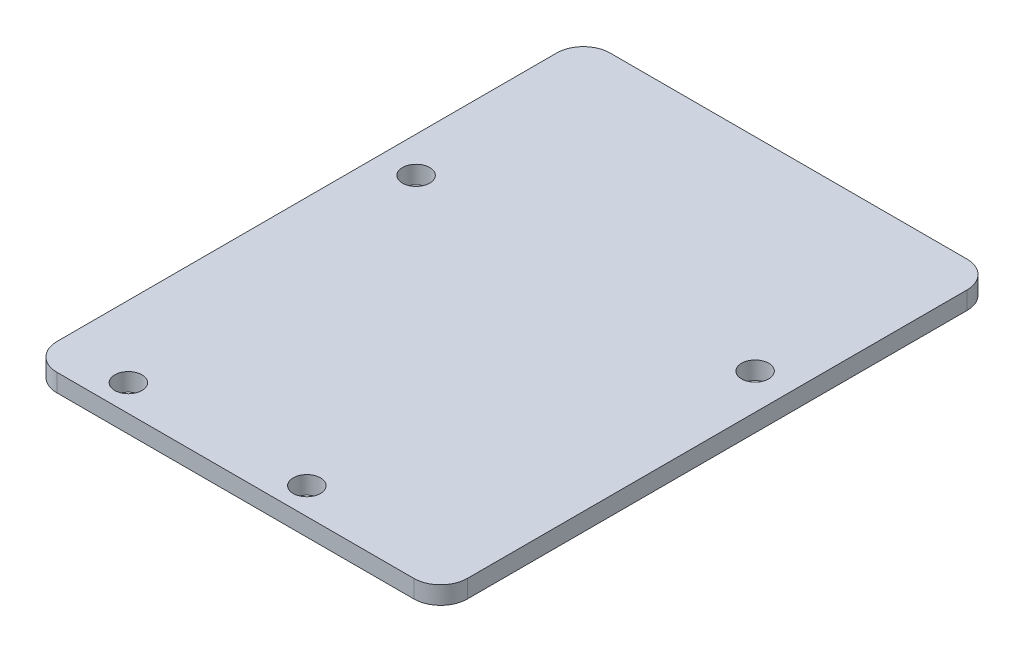
ISO-10303-21;
HEADER;
FILE_DESCRIPTION(('STEP AP214'),'2;1');
FILE_NAME('part.step','',(''),(''),'','','');
FILE_SCHEMA(('AUTOMOTIVE_DESIGN { 1 0 10303 214 1 1 1 1 }'));
ENDSEC;
DATA;
#1=APPLICATION_CONTEXT('core data for automotive mechanical design processes');
#2=APPLICATION_PROTOCOL_DEFINITION('international standard','automotive_design',2000,#1);
#3=PRODUCT_CONTEXT('',#1,'mechanical');
#4=PRODUCT('Part','Part','',(#3));
#5=PRODUCT_RELATED_PRODUCT_CATEGORY('part','',(#4));
#6=PRODUCT_DEFINITION_FORMATION('','',#4);
#7=PRODUCT_DEFINITION_CONTEXT('part definition',#1,'design');
#8=PRODUCT_DEFINITION('design','',#6,#7);
#9=PRODUCT_DEFINITION_SHAPE('','',#8);
#10=(LENGTH_UNIT() NAMED_UNIT(*) SI_UNIT(.MILLI.,.METRE.));
#11=(NAMED_UNIT(*) PLANE_ANGLE_UNIT() SI_UNIT($,.RADIAN.));
#12=(NAMED_UNIT(*) SI_UNIT($,.STERADIAN.) SOLID_ANGLE_UNIT());
#13=UNCERTAINTY_MEASURE_WITH_UNIT(LENGTH_MEASURE(1.E-05),#10,'distance_accuracy_value','');
#14=(GEOMETRIC_REPRESENTATION_CONTEXT(3) GLOBAL_UNCERTAINTY_ASSIGNED_CONTEXT((#13)) GLOBAL_UNIT_ASSIGNED_CONTEXT((#10,
#11,#12)) REPRESENTATION_CONTEXT('',''));
#15=CARTESIAN_POINT('',(0.,0.,0.));
#16=DIRECTION('',(0.,0.,1.));
#17=DIRECTION('',(1.,0.,0.));
#18=AXIS2_PLACEMENT_3D('',#15,#16,#17);
#19=CARTESIAN_POINT('',(23.,2.,31.));
#20=DIRECTION('',(-1.,0.,0.));
#21=DIRECTION('',(0.,0.,1.));
#22=AXIS2_PLACEMENT_3D('',#19,#20,#21);
#23=PLANE('',#22);
#24=DIRECTION('',(0.,0.,-1.));
#25=VECTOR('',#24,1.);
#26=CARTESIAN_POINT('',(23.,0.,31.));
#27=LINE('',#26,#25);
#28=CARTESIAN_POINT('',(23.,0.,28.));
#29=VERTEX_POINT('',#28);
#30=CARTESIAN_POINT('',(23.,0.,-28.));
#31=VERTEX_POINT('',#30);
#32=EDGE_CURVE('E129',#29,#31,#27,.T.);
#33=ORIENTED_EDGE('',*,*,#32,.T.);
#34=DIRECTION('',(0.,-1.,0.));
#35=VECTOR('',#34,1.);
#36=CARTESIAN_POINT('',(23.,2.,-28.));
#37=LINE('',#36,#35);
#38=CARTESIAN_POINT('',(23.,2.,-28.));
#39=VERTEX_POINT('',#38);
#40=EDGE_CURVE('E152',#31,#39,#37,.F.);
#41=ORIENTED_EDGE('',*,*,#40,.T.);
#42=DIRECTION('',(0.,0.,-1.));
#43=VECTOR('',#42,1.);
#44=CARTESIAN_POINT('',(23.,2.,31.));
#45=LINE('',#44,#43);
#46=CARTESIAN_POINT('',(23.,2.,28.));
#47=VERTEX_POINT('',#46);
#48=EDGE_CURVE('E127',#47,#39,#45,.T.);
#49=ORIENTED_EDGE('',*,*,#48,.F.);
#50=DIRECTION('',(0.,-1.,0.));
#51=VECTOR('',#50,1.);
#52=CARTESIAN_POINT('',(23.,2.,28.));
#53=LINE('',#52,#51);
#54=EDGE_CURVE('E149',#47,#29,#53,.T.);
#55=ORIENTED_EDGE('',*,*,#54,.T.);
#56=EDGE_LOOP('',(#33,#41,#49,#55));
#57=FACE_BOUND('',#56,.T.);
#58=ADVANCED_FACE('F34',(#57),#23,.F.);
#59=CARTESIAN_POINT('',(-23.,2.,-31.));
#60=DIRECTION('',(0.,0.,1.));
#61=DIRECTION('',(1.,0.,0.));
#62=AXIS2_PLACEMENT_3D('',#59,#60,#61);
#63=PLANE('',#62);
#64=DIRECTION('',(-1.,0.,0.));
#65=VECTOR('',#64,1.);
#66=CARTESIAN_POINT('',(-23.,0.,-31.));
#67=LINE('',#66,#65);
#68=CARTESIAN_POINT('',(20.,0.,-31.));
#69=VERTEX_POINT('',#68);
#70=CARTESIAN_POINT('',(-20.,0.,-31.));
#71=VERTEX_POINT('',#70);
#72=EDGE_CURVE('E125',#69,#71,#67,.T.);
#73=ORIENTED_EDGE('',*,*,#72,.T.);
#74=DIRECTION('',(0.,-1.,0.));
#75=VECTOR('',#74,1.);
#76=CARTESIAN_POINT('',(-20.,2.,-31.));
#77=LINE('',#76,#75);
#78=CARTESIAN_POINT('',(-20.,2.,-31.));
#79=VERTEX_POINT('',#78);
#80=EDGE_CURVE('E104',#71,#79,#77,.F.);
#81=ORIENTED_EDGE('',*,*,#80,.T.);
#82=DIRECTION('',(-1.,0.,0.));
#83=VECTOR('',#82,1.);
#84=CARTESIAN_POINT('',(-23.,2.,-31.));
#85=LINE('',#84,#83);
#86=CARTESIAN_POINT('',(20.,2.,-31.));
#87=VERTEX_POINT('',#86);
#88=EDGE_CURVE('E168',#87,#79,#85,.T.);
#89=ORIENTED_EDGE('',*,*,#88,.F.);
#90=DIRECTION('',(0.,-1.,0.));
#91=VECTOR('',#90,1.);
#92=CARTESIAN_POINT('',(20.,2.,-31.));
#93=LINE('',#92,#91);
#94=EDGE_CURVE('E109',#87,#69,#93,.T.);
#95=ORIENTED_EDGE('',*,*,#94,.T.);
#96=EDGE_LOOP('',(#73,#81,#89,#95));
#97=FACE_BOUND('',#96,.T.);
#98=ADVANCED_FACE('F219',(#97),#63,.F.);
#99=CARTESIAN_POINT('',(-23.,2.,31.));
#100=DIRECTION('',(1.,0.,0.));
#101=DIRECTION('',(0.,0.,-1.));
#102=AXIS2_PLACEMENT_3D('',#99,#100,#101);
#103=PLANE('',#102);
#104=DIRECTION('',(0.,0.,1.));
#105=VECTOR('',#104,1.);
#106=CARTESIAN_POINT('',(-23.,2.,31.));
#107=LINE('',#106,#105);
#108=CARTESIAN_POINT('',(-23.,2.,-28.));
#109=VERTEX_POINT('',#108);
#110=CARTESIAN_POINT('',(-23.,2.,28.));
#111=VERTEX_POINT('',#110);
#112=EDGE_CURVE('E118',#109,#111,#107,.T.);
#113=ORIENTED_EDGE('',*,*,#112,.F.);
#114=DIRECTION('',(0.,-1.,0.));
#115=VECTOR('',#114,1.);
#116=CARTESIAN_POINT('',(-23.,2.,-28.));
#117=LINE('',#116,#115);
#118=CARTESIAN_POINT('',(-23.,0.,-28.));
#119=VERTEX_POINT('',#118);
#120=EDGE_CURVE('E103',#109,#119,#117,.T.);
#121=ORIENTED_EDGE('',*,*,#120,.T.);
#122=DIRECTION('',(0.,0.,1.));
#123=VECTOR('',#122,1.);
#124=CARTESIAN_POINT('',(-23.,0.,31.));
#125=LINE('',#124,#123);
#126=CARTESIAN_POINT('',(-23.,0.,28.));
#127=VERTEX_POINT('',#126);
#128=EDGE_CURVE('E116',#119,#127,#125,.T.);
#129=ORIENTED_EDGE('',*,*,#128,.T.);
#130=DIRECTION('',(0.,-1.,0.));
#131=VECTOR('',#130,1.);
#132=CARTESIAN_POINT('',(-23.,2.,28.));
#133=LINE('',#132,#131);
#134=EDGE_CURVE('E120',#127,#111,#133,.F.);
#135=ORIENTED_EDGE('',*,*,#134,.T.);
#136=EDGE_LOOP('',(#113,#121,#129,#135));
#137=FACE_BOUND('',#136,.T.);
#138=ADVANCED_FACE('F115',(#137),#103,.F.);
#139=CARTESIAN_POINT('',(-23.,2.,31.));
#140=DIRECTION('',(0.,0.,-1.));
#141=DIRECTION('',(-1.,0.,0.));
#142=AXIS2_PLACEMENT_3D('',#139,#140,#141);
#143=PLANE('',#142);
#144=DIRECTION('',(1.,0.,0.));
#145=VECTOR('',#144,1.);
#146=CARTESIAN_POINT('',(-23.,0.,31.));
#147=LINE('',#146,#145);
#148=CARTESIAN_POINT('',(-20.,0.,31.));
#149=VERTEX_POINT('',#148);
#150=CARTESIAN_POINT('',(20.,0.,31.));
#151=VERTEX_POINT('',#150);
#152=EDGE_CURVE('E124',#149,#151,#147,.T.);
#153=ORIENTED_EDGE('',*,*,#152,.T.);
#154=DIRECTION('',(0.,-1.,0.));
#155=VECTOR('',#154,1.);
#156=CARTESIAN_POINT('',(20.,2.,31.));
#157=LINE('',#156,#155);
#158=CARTESIAN_POINT('',(20.,2.,31.));
#159=VERTEX_POINT('',#158);
#160=EDGE_CURVE('E11',#151,#159,#157,.F.);
#161=ORIENTED_EDGE('',*,*,#160,.T.);
#162=DIRECTION('',(1.,0.,0.));
#163=VECTOR('',#162,1.);
#164=CARTESIAN_POINT('',(-23.,2.,31.));
#165=LINE('',#164,#163);
#166=CARTESIAN_POINT('',(-20.,2.,31.));
#167=VERTEX_POINT('',#166);
#168=EDGE_CURVE('E133',#167,#159,#165,.T.);
#169=ORIENTED_EDGE('',*,*,#168,.F.);
#170=DIRECTION('',(0.,-1.,0.));
#171=VECTOR('',#170,1.);
#172=CARTESIAN_POINT('',(-20.,2.,31.));
#173=LINE('',#172,#171);
#174=EDGE_CURVE('E42',#167,#149,#173,.T.);
#175=ORIENTED_EDGE('',*,*,#174,.T.);
#176=EDGE_LOOP('',(#153,#161,#169,#175));
#177=FACE_BOUND('',#176,.T.);
#178=ADVANCED_FACE('F155',(#177),#143,.F.);
#179=CARTESIAN_POINT('',(0.,2.,0.));
#180=DIRECTION('',(0.,-1.,0.));
#181=DIRECTION('',(0.,0.,-1.));
#182=AXIS2_PLACEMENT_3D('',#179,#180,#181);
#183=PLANE('',#182);
#184=CARTESIAN_POINT('',(5.,2.,28.));
#185=DIRECTION('',(0.,-1.,0.));
#186=DIRECTION('',(0.,0.,-1.));
#187=AXIS2_PLACEMENT_3D('',#184,#185,#186);
#188=CIRCLE('',#187,1.525);
#189=CARTESIAN_POINT('',(5.,2.,26.475));
#190=VERTEX_POINT('',#189);
#191=EDGE_CURVE('E188',#190,#190,#188,.F.);
#192=ORIENTED_EDGE('',*,*,#191,.F.);
#193=EDGE_LOOP('',(#192));
#194=FACE_BOUND('',#193,.T.);
#195=CARTESIAN_POINT('',(-15.,2.,28.));
#196=DIRECTION('',(0.,-1.,0.));
#197=DIRECTION('',(0.,0.,-1.));
#198=AXIS2_PLACEMENT_3D('',#195,#196,#197);
#199=CIRCLE('',#198,1.525);
#200=CARTESIAN_POINT('',(-15.,2.,26.475));
#201=VERTEX_POINT('',#200);
#202=EDGE_CURVE('E198',#201,#201,#199,.F.);
#203=ORIENTED_EDGE('',*,*,#202,.F.);
#204=EDGE_LOOP('',(#203));
#205=FACE_BOUND('',#204,.T.);
#206=CARTESIAN_POINT('',(19.,2.,-8.25));
#207=DIRECTION('',(0.,-1.,0.));
#208=DIRECTION('',(0.,0.,-1.));
#209=AXIS2_PLACEMENT_3D('',#206,#207,#208);
#210=CIRCLE('',#209,1.525);
#211=CARTESIAN_POINT('',(19.,2.,-9.775));
#212=VERTEX_POINT('',#211);
#213=EDGE_CURVE('E177',#212,#212,#210,.F.);
#214=ORIENTED_EDGE('',*,*,#213,.F.);
#215=EDGE_LOOP('',(#214));
#216=FACE_BOUND('',#215,.T.);
#217=CARTESIAN_POINT('',(-19.,2.,-8.25));
#218=DIRECTION('',(0.,-1.,0.));
#219=DIRECTION('',(0.,0.,-1.));
#220=AXIS2_PLACEMENT_3D('',#217,#218,#219);
#221=CIRCLE('',#220,1.525);
#222=CARTESIAN_POINT('',(-19.,2.,-9.775));
#223=VERTEX_POINT('',#222);
#224=EDGE_CURVE('E173',#223,#223,#221,.F.);
#225=ORIENTED_EDGE('',*,*,#224,.F.);
#226=EDGE_LOOP('',(#225));
#227=FACE_BOUND('',#226,.T.);
#228=ORIENTED_EDGE('',*,*,#88,.T.);
#229=CARTESIAN_POINT('',(-20.,2.,-28.));
#230=DIRECTION('',(0.,-1.,0.));
#231=DIRECTION('',(0.,0.,-1.));
#232=AXIS2_PLACEMENT_3D('',#229,#230,#231);
#233=CIRCLE('',#232,3.);
#234=EDGE_CURVE('E147',#79,#109,#233,.F.);
#235=ORIENTED_EDGE('',*,*,#234,.T.);
#236=ORIENTED_EDGE('',*,*,#112,.T.);
#237=CARTESIAN_POINT('',(-20.,2.,28.));
#238=DIRECTION('',(0.,-1.,0.));
#239=DIRECTION('',(0.,0.,-1.));
#240=AXIS2_PLACEMENT_3D('',#237,#238,#239);
#241=CIRCLE('',#240,3.);
#242=EDGE_CURVE('E54',#111,#167,#241,.F.);
#243=ORIENTED_EDGE('',*,*,#242,.T.);
#244=ORIENTED_EDGE('',*,*,#168,.T.);
#245=CARTESIAN_POINT('',(20.,2.,28.));
#246=DIRECTION('',(0.,-1.,0.));
#247=DIRECTION('',(0.,0.,-1.));
#248=AXIS2_PLACEMENT_3D('',#245,#246,#247);
#249=CIRCLE('',#248,3.);
#250=EDGE_CURVE('E143',#159,#47,#249,.F.);
#251=ORIENTED_EDGE('',*,*,#250,.T.);
#252=ORIENTED_EDGE('',*,*,#48,.T.);
#253=CARTESIAN_POINT('',(20.,2.,-28.));
#254=DIRECTION('',(0.,-1.,0.));
#255=DIRECTION('',(0.,0.,-1.));
#256=AXIS2_PLACEMENT_3D('',#253,#254,#255);
#257=CIRCLE('',#256,3.);
#258=EDGE_CURVE('E145',#39,#87,#257,.F.);
#259=ORIENTED_EDGE('',*,*,#258,.T.);
#260=EDGE_LOOP('',(#228,#235,#236,#243,#244,#251,#252,#259));
#261=FACE_BOUND('',#260,.T.);
#262=ADVANCED_FACE('F209',(#194,#205,#216,#227,#261),#183,.F.);
#263=CARTESIAN_POINT('',(0.,0.,0.));
#264=DIRECTION('',(0.,-1.,0.));
#265=DIRECTION('',(0.,0.,-1.));
#266=AXIS2_PLACEMENT_3D('',#263,#264,#265);
#267=PLANE('',#266);
#268=CARTESIAN_POINT('',(5.,0.,28.));
#269=DIRECTION('',(0.,-1.,0.));
#270=DIRECTION('',(0.,0.,-1.));
#271=AXIS2_PLACEMENT_3D('',#268,#269,#270);
#272=CIRCLE('',#271,1.525);
#273=CARTESIAN_POINT('',(5.,0.,26.475));
#274=VERTEX_POINT('',#273);
#275=EDGE_CURVE('E193',#274,#274,#272,.T.);
#276=ORIENTED_EDGE('',*,*,#275,.F.);
#277=EDGE_LOOP('',(#276));
#278=FACE_BOUND('',#277,.T.);
#279=CARTESIAN_POINT('',(-15.,0.,28.));
#280=DIRECTION('',(0.,-1.,0.));
#281=DIRECTION('',(0.,0.,-1.));
#282=AXIS2_PLACEMENT_3D('',#279,#280,#281);
#283=CIRCLE('',#282,1.525);
#284=CARTESIAN_POINT('',(-15.,0.,26.475));
#285=VERTEX_POINT('',#284);
#286=EDGE_CURVE('E201',#285,#285,#283,.T.);
#287=ORIENTED_EDGE('',*,*,#286,.F.);
#288=EDGE_LOOP('',(#287));
#289=FACE_BOUND('',#288,.T.);
#290=CARTESIAN_POINT('',(19.,0.,-8.25));
#291=DIRECTION('',(0.,-1.,0.));
#292=DIRECTION('',(0.,0.,-1.));
#293=AXIS2_PLACEMENT_3D('',#290,#291,#292);
#294=CIRCLE('',#293,1.525);
#295=CARTESIAN_POINT('',(19.,0.,-9.775));
#296=VERTEX_POINT('',#295);
#297=EDGE_CURVE('E179',#296,#296,#294,.T.);
#298=ORIENTED_EDGE('',*,*,#297,.F.);
#299=EDGE_LOOP('',(#298));
#300=FACE_BOUND('',#299,.T.);
#301=CARTESIAN_POINT('',(-19.,0.,-8.25));
#302=DIRECTION('',(0.,-1.,0.));
#303=DIRECTION('',(0.,0.,-1.));
#304=AXIS2_PLACEMENT_3D('',#301,#302,#303);
#305=CIRCLE('',#304,1.525);
#306=CARTESIAN_POINT('',(-19.,0.,-9.775));
#307=VERTEX_POINT('',#306);
#308=EDGE_CURVE('E186',#307,#307,#305,.T.);
#309=ORIENTED_EDGE('',*,*,#308,.F.);
#310=EDGE_LOOP('',(#309));
#311=FACE_BOUND('',#310,.T.);
#312=ORIENTED_EDGE('',*,*,#128,.F.);
#313=CARTESIAN_POINT('',(-20.,0.,-28.));
#314=DIRECTION('',(0.,-1.,0.));
#315=DIRECTION('',(0.,0.,-1.));
#316=AXIS2_PLACEMENT_3D('',#313,#314,#315);
#317=CIRCLE('',#316,3.);
#318=EDGE_CURVE('E99',#119,#71,#317,.T.);
#319=ORIENTED_EDGE('',*,*,#318,.T.);
#320=ORIENTED_EDGE('',*,*,#72,.F.);
#321=CARTESIAN_POINT('',(20.,0.,-28.));
#322=DIRECTION('',(0.,-1.,0.));
#323=DIRECTION('',(0.,0.,-1.));
#324=AXIS2_PLACEMENT_3D('',#321,#322,#323);
#325=CIRCLE('',#324,3.);
#326=EDGE_CURVE('E110',#69,#31,#325,.T.);
#327=ORIENTED_EDGE('',*,*,#326,.T.);
#328=ORIENTED_EDGE('',*,*,#32,.F.);
#329=CARTESIAN_POINT('',(20.,0.,28.));
#330=DIRECTION('',(0.,-1.,0.));
#331=DIRECTION('',(0.,0.,-1.));
#332=AXIS2_PLACEMENT_3D('',#329,#330,#331);
#333=CIRCLE('',#332,3.);
#334=EDGE_CURVE('E136',#29,#151,#333,.T.);
#335=ORIENTED_EDGE('',*,*,#334,.T.);
#336=ORIENTED_EDGE('',*,*,#152,.F.);
#337=CARTESIAN_POINT('',(-20.,0.,28.));
#338=DIRECTION('',(0.,-1.,0.));
#339=DIRECTION('',(0.,0.,-1.));
#340=AXIS2_PLACEMENT_3D('',#337,#338,#339);
#341=CIRCLE('',#340,3.);
#342=EDGE_CURVE('E119',#149,#127,#341,.T.);
#343=ORIENTED_EDGE('',*,*,#342,.T.);
#344=EDGE_LOOP('',(#312,#319,#320,#327,#328,#335,#336,#343));
#345=FACE_BOUND('',#344,.T.);
#346=ADVANCED_FACE('F122',(#278,#289,#300,#311,#345),#267,.T.);
#347=CARTESIAN_POINT('',(-19.,6.31335136523794,-8.25));
#348=DIRECTION('',(0.,-1.,0.));
#349=DIRECTION('',(0.,0.,-1.));
#350=AXIS2_PLACEMENT_3D('',#347,#348,#349);
#351=CYLINDRICAL_SURFACE('',#350,1.525);
#352=ORIENTED_EDGE('',*,*,#224,.T.);
#353=EDGE_LOOP('',(#352));
#354=FACE_BOUND('',#353,.T.);
#355=ORIENTED_EDGE('',*,*,#308,.T.);
#356=EDGE_LOOP('',(#355));
#357=FACE_BOUND('',#356,.T.);
#358=ADVANCED_FACE('F242',(#354,#357),#351,.F.);
#359=CARTESIAN_POINT('',(19.,6.31335136523794,-8.25));
#360=DIRECTION('',(0.,-1.,0.));
#361=DIRECTION('',(0.,0.,-1.));
#362=AXIS2_PLACEMENT_3D('',#359,#360,#361);
#363=CYLINDRICAL_SURFACE('',#362,1.525);
#364=ORIENTED_EDGE('',*,*,#213,.T.);
#365=EDGE_LOOP('',(#364));
#366=FACE_BOUND('',#365,.T.);
#367=ORIENTED_EDGE('',*,*,#297,.T.);
#368=EDGE_LOOP('',(#367));
#369=FACE_BOUND('',#368,.T.);
#370=ADVANCED_FACE('F247',(#366,#369),#363,.F.);
#371=CARTESIAN_POINT('',(-15.,6.31335136523794,28.));
#372=DIRECTION('',(0.,-1.,0.));
#373=DIRECTION('',(0.,0.,-1.));
#374=AXIS2_PLACEMENT_3D('',#371,#372,#373);
#375=CYLINDRICAL_SURFACE('',#374,1.525);
#376=ORIENTED_EDGE('',*,*,#202,.T.);
#377=EDGE_LOOP('',(#376));
#378=FACE_BOUND('',#377,.T.);
#379=ORIENTED_EDGE('',*,*,#286,.T.);
#380=EDGE_LOOP('',(#379));
#381=FACE_BOUND('',#380,.T.);
#382=ADVANCED_FACE('F206',(#378,#381),#375,.F.);
#383=CARTESIAN_POINT('',(5.,6.31335136523794,28.));
#384=DIRECTION('',(0.,-1.,0.));
#385=DIRECTION('',(0.,0.,-1.));
#386=AXIS2_PLACEMENT_3D('',#383,#384,#385);
#387=CYLINDRICAL_SURFACE('',#386,1.525);
#388=ORIENTED_EDGE('',*,*,#191,.T.);
#389=EDGE_LOOP('',(#388));
#390=FACE_BOUND('',#389,.T.);
#391=ORIENTED_EDGE('',*,*,#275,.T.);
#392=EDGE_LOOP('',(#391));
#393=FACE_BOUND('',#392,.T.);
#394=ADVANCED_FACE('F228',(#390,#393),#387,.F.);
#395=CARTESIAN_POINT('',(-20.,2.,-28.));
#396=DIRECTION('',(0.,-1.,0.));
#397=DIRECTION('',(0.,0.,-1.));
#398=AXIS2_PLACEMENT_3D('',#395,#396,#397);
#399=CYLINDRICAL_SURFACE('',#398,3.);
#400=ORIENTED_EDGE('',*,*,#234,.F.);
#401=ORIENTED_EDGE('',*,*,#80,.F.);
#402=ORIENTED_EDGE('',*,*,#318,.F.);
#403=ORIENTED_EDGE('',*,*,#120,.F.);
#404=EDGE_LOOP('',(#400,#401,#402,#403));
#405=FACE_BOUND('',#404,.T.);
#406=ADVANCED_FACE('F102',(#405),#399,.T.);
#407=CARTESIAN_POINT('',(20.,2.,-28.));
#408=DIRECTION('',(0.,-1.,0.));
#409=DIRECTION('',(0.,0.,-1.));
#410=AXIS2_PLACEMENT_3D('',#407,#408,#409);
#411=CYLINDRICAL_SURFACE('',#410,3.);
#412=ORIENTED_EDGE('',*,*,#258,.F.);
#413=ORIENTED_EDGE('',*,*,#40,.F.);
#414=ORIENTED_EDGE('',*,*,#326,.F.);
#415=ORIENTED_EDGE('',*,*,#94,.F.);
#416=EDGE_LOOP('',(#412,#413,#414,#415));
#417=FACE_BOUND('',#416,.T.);
#418=ADVANCED_FACE('F221',(#417),#411,.T.);
#419=CARTESIAN_POINT('',(20.,2.,28.));
#420=DIRECTION('',(0.,-1.,0.));
#421=DIRECTION('',(0.,0.,-1.));
#422=AXIS2_PLACEMENT_3D('',#419,#420,#421);
#423=CYLINDRICAL_SURFACE('',#422,3.);
#424=ORIENTED_EDGE('',*,*,#250,.F.);
#425=ORIENTED_EDGE('',*,*,#160,.F.);
#426=ORIENTED_EDGE('',*,*,#334,.F.);
#427=ORIENTED_EDGE('',*,*,#54,.F.);
#428=EDGE_LOOP('',(#424,#425,#426,#427));
#429=FACE_BOUND('',#428,.T.);
#430=ADVANCED_FACE('F162',(#429),#423,.T.);
#431=CARTESIAN_POINT('',(-20.,2.,28.));
#432=DIRECTION('',(0.,-1.,0.));
#433=DIRECTION('',(0.,0.,-1.));
#434=AXIS2_PLACEMENT_3D('',#431,#432,#433);
#435=CYLINDRICAL_SURFACE('',#434,3.);
#436=ORIENTED_EDGE('',*,*,#242,.F.);
#437=ORIENTED_EDGE('',*,*,#134,.F.);
#438=ORIENTED_EDGE('',*,*,#342,.F.);
#439=ORIENTED_EDGE('',*,*,#174,.F.);
#440=EDGE_LOOP('',(#436,#437,#438,#439));
#441=FACE_BOUND('',#440,.T.);
#442=ADVANCED_FACE('F36',(#441),#435,.T.);
#443=CLOSED_SHELL('',(#58,#98,#138,#178,#262,#346,#358,#370,#382,#394,#406,#418,#430,#442));
#444=MANIFOLD_SOLID_BREP('B2',#443);
#445=ADVANCED_BREP_SHAPE_REPRESENTATION('',(#18,#444),#14);
#446=SHAPE_DEFINITION_REPRESENTATION(#9,#445);
ENDSEC;
END-ISO-10303-21;
